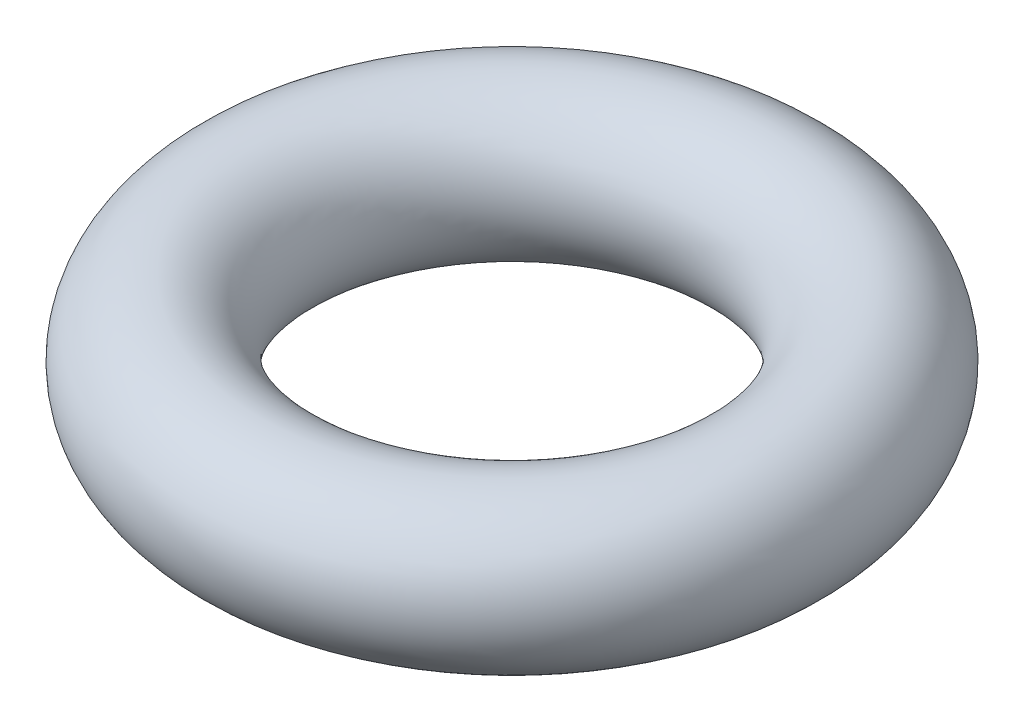
ISO-10303-21;
HEADER;
FILE_DESCRIPTION(('STEP AP214'),'2;1');
FILE_NAME('part.step','',(''),(''),'','','');
FILE_SCHEMA(('AUTOMOTIVE_DESIGN { 1 0 10303 214 1 1 1 1 }'));
ENDSEC;
DATA;
#1=APPLICATION_CONTEXT('core data for automotive mechanical design processes');
#2=APPLICATION_PROTOCOL_DEFINITION('international standard','automotive_design',2000,#1);
#3=PRODUCT_CONTEXT('',#1,'mechanical');
#4=PRODUCT('Part','Part','',(#3));
#5=PRODUCT_RELATED_PRODUCT_CATEGORY('part','',(#4));
#6=PRODUCT_DEFINITION_FORMATION('','',#4);
#7=PRODUCT_DEFINITION_CONTEXT('part definition',#1,'design');
#8=PRODUCT_DEFINITION('design','',#6,#7);
#9=PRODUCT_DEFINITION_SHAPE('','',#8);
#10=(LENGTH_UNIT() NAMED_UNIT(*) SI_UNIT(.MILLI.,.METRE.));
#11=(NAMED_UNIT(*) PLANE_ANGLE_UNIT() SI_UNIT($,.RADIAN.));
#12=(NAMED_UNIT(*) SI_UNIT($,.STERADIAN.) SOLID_ANGLE_UNIT());
#13=UNCERTAINTY_MEASURE_WITH_UNIT(LENGTH_MEASURE(1.E-05),#10,'distance_accuracy_value','');
#14=(GEOMETRIC_REPRESENTATION_CONTEXT(3) GLOBAL_UNCERTAINTY_ASSIGNED_CONTEXT((#13)) GLOBAL_UNIT_ASSIGNED_CONTEXT((#10,
#11,#12)) REPRESENTATION_CONTEXT('',''));
#15=CARTESIAN_POINT('',(0.,0.,0.));
#16=DIRECTION('',(0.,0.,1.));
#17=DIRECTION('',(1.,0.,0.));
#18=AXIS2_PLACEMENT_3D('',#15,#16,#17);
#19=CARTESIAN_POINT('',(0.,0.,0.));
#20=DIRECTION('',(0.,-1.,0.));
#21=DIRECTION('',(0.,0.,-1.));
#22=AXIS2_PLACEMENT_3D('',#19,#20,#21);
#23=TOROIDAL_SURFACE('',#22,3.,0.899999999999997);
#24=ADVANCED_FACE('F14',(),#23,.T.);
#25=CLOSED_SHELL('',(#24));
#26=MANIFOLD_SOLID_BREP('B1',#25);
#27=ADVANCED_BREP_SHAPE_REPRESENTATION('',(#18,#26),#14);
#28=SHAPE_DEFINITION_REPRESENTATION(#9,#27);
ENDSEC;
END-ISO-10303-21;
